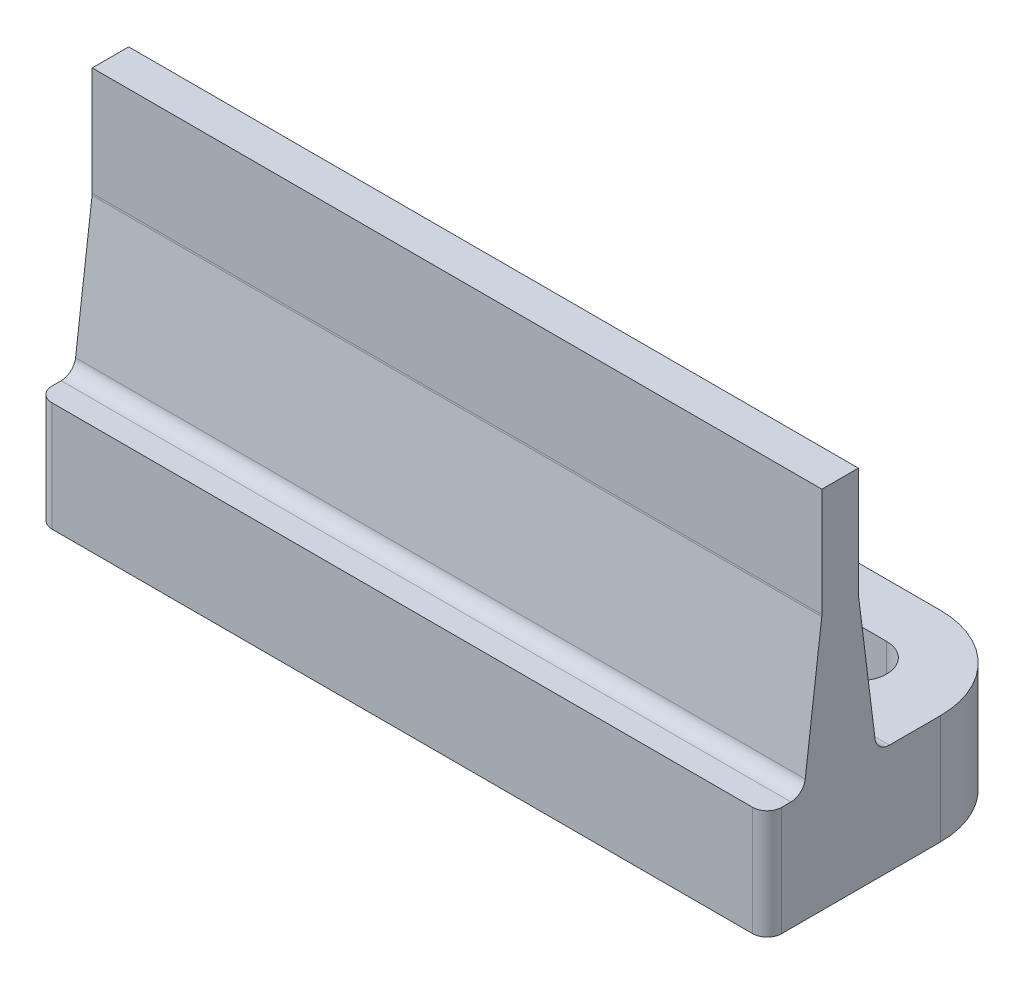
ISO-10303-21;
HEADER;
FILE_DESCRIPTION(('STEP AP214'),'2;1');
FILE_NAME('part.step','',(''),(''),'','','');
FILE_SCHEMA(('AUTOMOTIVE_DESIGN { 1 0 10303 214 1 1 1 1 }'));
ENDSEC;
DATA;
#1=APPLICATION_CONTEXT('core data for automotive mechanical design processes');
#2=APPLICATION_PROTOCOL_DEFINITION('international standard','automotive_design',2000,#1);
#3=PRODUCT_CONTEXT('',#1,'mechanical');
#4=PRODUCT('Part','Part','',(#3));
#5=PRODUCT_RELATED_PRODUCT_CATEGORY('part','',(#4));
#6=PRODUCT_DEFINITION_FORMATION('','',#4);
#7=PRODUCT_DEFINITION_CONTEXT('part definition',#1,'design');
#8=PRODUCT_DEFINITION('design','',#6,#7);
#9=PRODUCT_DEFINITION_SHAPE('','',#8);
#10=(LENGTH_UNIT() NAMED_UNIT(*) SI_UNIT(.MILLI.,.METRE.));
#11=(NAMED_UNIT(*) PLANE_ANGLE_UNIT() SI_UNIT($,.RADIAN.));
#12=(NAMED_UNIT(*) SI_UNIT($,.STERADIAN.) SOLID_ANGLE_UNIT());
#13=UNCERTAINTY_MEASURE_WITH_UNIT(LENGTH_MEASURE(1.E-05),#10,'distance_accuracy_value','');
#14=(GEOMETRIC_REPRESENTATION_CONTEXT(3) GLOBAL_UNCERTAINTY_ASSIGNED_CONTEXT((#13)) GLOBAL_UNIT_ASSIGNED_CONTEXT((#10,
#11,#12)) REPRESENTATION_CONTEXT('',''));
#15=CARTESIAN_POINT('',(0.,0.,0.));
#16=DIRECTION('',(0.,0.,1.));
#17=DIRECTION('',(1.,0.,0.));
#18=AXIS2_PLACEMENT_3D('',#15,#16,#17);
#19=CARTESIAN_POINT('',(20.,6.,4.));
#20=DIRECTION('',(0.,0.,-1.));
#21=DIRECTION('',(0.,1.,0.));
#22=AXIS2_PLACEMENT_3D('',#19,#20,#21);
#23=PLANE('',#22);
#24=DIRECTION('',(-1.,0.,0.));
#25=VECTOR('',#24,1.);
#26=CARTESIAN_POINT('',(20.,0.,4.));
#27=LINE('',#26,#25);
#28=CARTESIAN_POINT('',(19.20625,0.,4.));
#29=VERTEX_POINT('',#28);
#30=CARTESIAN_POINT('',(-19.20625,0.,4.));
#31=VERTEX_POINT('',#30);
#32=EDGE_CURVE('E387',#29,#31,#27,.T.);
#33=ORIENTED_EDGE('',*,*,#32,.F.);
#34=DIRECTION('',(0.,-1.,0.));
#35=VECTOR('',#34,1.);
#36=CARTESIAN_POINT('',(19.20625,6.,4.));
#37=LINE('',#36,#35);
#38=CARTESIAN_POINT('',(19.20625,6.,4.));
#39=VERTEX_POINT('',#38);
#40=EDGE_CURVE('E464',#29,#39,#37,.F.);
#41=ORIENTED_EDGE('',*,*,#40,.T.);
#42=DIRECTION('',(-1.,0.,0.));
#43=VECTOR('',#42,1.);
#44=CARTESIAN_POINT('',(20.,6.,4.));
#45=LINE('',#44,#43);
#46=CARTESIAN_POINT('',(-19.20625,6.,4.));
#47=VERTEX_POINT('',#46);
#48=EDGE_CURVE('E340',#39,#47,#45,.T.);
#49=ORIENTED_EDGE('',*,*,#48,.T.);
#50=DIRECTION('',(0.,-1.,0.));
#51=VECTOR('',#50,1.);
#52=CARTESIAN_POINT('',(-19.20625,6.,4.));
#53=LINE('',#52,#51);
#54=EDGE_CURVE('E461',#47,#31,#53,.T.);
#55=ORIENTED_EDGE('',*,*,#54,.T.);
#56=EDGE_LOOP('',(#33,#41,#49,#55));
#57=FACE_BOUND('',#56,.T.);
#58=ADVANCED_FACE('F39',(#57),#23,.F.);
#59=CARTESIAN_POINT('',(20.,0.,4.));
#60=DIRECTION('',(0.,1.,0.));
#61=DIRECTION('',(0.,0.,1.));
#62=AXIS2_PLACEMENT_3D('',#59,#60,#61);
#63=PLANE('',#62);
#64=DIRECTION('',(1.,0.,0.));
#65=VECTOR('',#64,1.);
#66=CARTESIAN_POINT('',(-15.,0.,-7.55));
#67=LINE('',#66,#65);
#68=CARTESIAN_POINT('',(-15.,0.,-7.55));
#69=VERTEX_POINT('',#68);
#70=CARTESIAN_POINT('',(-5.,0.,-7.55));
#71=VERTEX_POINT('',#70);
#72=EDGE_CURVE('E240',#69,#71,#67,.T.);
#73=ORIENTED_EDGE('',*,*,#72,.F.);
#74=CARTESIAN_POINT('',(-15.,0.,-6.));
#75=DIRECTION('',(0.,1.,0.));
#76=DIRECTION('',(0.,0.,1.));
#77=AXIS2_PLACEMENT_3D('',#74,#75,#76);
#78=CIRCLE('',#77,1.55);
#79=CARTESIAN_POINT('',(-15.,0.,-4.45));
#80=VERTEX_POINT('',#79);
#81=EDGE_CURVE('E216',#80,#69,#78,.F.);
#82=ORIENTED_EDGE('',*,*,#81,.F.);
#83=DIRECTION('',(-1.,0.,0.));
#84=VECTOR('',#83,1.);
#85=CARTESIAN_POINT('',(-15.,0.,-4.45));
#86=LINE('',#85,#84);
#87=CARTESIAN_POINT('',(-5.,0.,-4.45));
#88=VERTEX_POINT('',#87);
#89=EDGE_CURVE('E229',#88,#80,#86,.T.);
#90=ORIENTED_EDGE('',*,*,#89,.F.);
#91=CARTESIAN_POINT('',(-5.,0.,-6.));
#92=DIRECTION('',(0.,1.,0.));
#93=DIRECTION('',(0.,0.,1.));
#94=AXIS2_PLACEMENT_3D('',#91,#92,#93);
#95=CIRCLE('',#94,1.55);
#96=EDGE_CURVE('E247',#71,#88,#95,.F.);
#97=ORIENTED_EDGE('',*,*,#96,.F.);
#98=EDGE_LOOP('',(#73,#82,#90,#97));
#99=FACE_BOUND('',#98,.T.);
#100=DIRECTION('',(1.,0.,0.));
#101=VECTOR('',#100,1.);
#102=CARTESIAN_POINT('',(5.,0.,-7.55));
#103=LINE('',#102,#101);
#104=CARTESIAN_POINT('',(5.,0.,-7.55));
#105=VERTEX_POINT('',#104);
#106=CARTESIAN_POINT('',(15.,0.,-7.55));
#107=VERTEX_POINT('',#106);
#108=EDGE_CURVE('E270',#105,#107,#103,.T.);
#109=ORIENTED_EDGE('',*,*,#108,.F.);
#110=CARTESIAN_POINT('',(5.,0.,-6.));
#111=DIRECTION('',(0.,1.,0.));
#112=DIRECTION('',(0.,0.,1.));
#113=AXIS2_PLACEMENT_3D('',#110,#111,#112);
#114=CIRCLE('',#113,1.55);
#115=CARTESIAN_POINT('',(5.,0.,-4.45));
#116=VERTEX_POINT('',#115);
#117=EDGE_CURVE('E274',#116,#105,#114,.F.);
#118=ORIENTED_EDGE('',*,*,#117,.F.);
#119=DIRECTION('',(-1.,0.,0.));
#120=VECTOR('',#119,1.);
#121=CARTESIAN_POINT('',(5.,0.,-4.45));
#122=LINE('',#121,#120);
#123=CARTESIAN_POINT('',(15.,0.,-4.45));
#124=VERTEX_POINT('',#123);
#125=EDGE_CURVE('E297',#124,#116,#122,.T.);
#126=ORIENTED_EDGE('',*,*,#125,.F.);
#127=CARTESIAN_POINT('',(15.,0.,-6.));
#128=DIRECTION('',(0.,1.,0.));
#129=DIRECTION('',(0.,0.,1.));
#130=AXIS2_PLACEMENT_3D('',#127,#128,#129);
#131=CIRCLE('',#130,1.55);
#132=EDGE_CURVE('E267',#107,#124,#131,.F.);
#133=ORIENTED_EDGE('',*,*,#132,.F.);
#134=EDGE_LOOP('',(#109,#118,#126,#133));
#135=FACE_BOUND('',#134,.T.);
#136=DIRECTION('',(0.,0.,-1.));
#137=VECTOR('',#136,1.);
#138=CARTESIAN_POINT('',(20.,0.,4.));
#139=LINE('',#138,#137);
#140=CARTESIAN_POINT('',(20.,0.,3.20625));
#141=VERTEX_POINT('',#140);
#142=CARTESIAN_POINT('',(20.,0.,-5.5));
#143=VERTEX_POINT('',#142);
#144=EDGE_CURVE('E310',#141,#143,#139,.T.);
#145=ORIENTED_EDGE('',*,*,#144,.F.);
#146=CARTESIAN_POINT('',(19.20625,0.,3.20625));
#147=DIRECTION('',(0.,1.,0.));
#148=DIRECTION('',(0.,0.,1.));
#149=AXIS2_PLACEMENT_3D('',#146,#147,#148);
#150=CIRCLE('',#149,0.79375);
#151=EDGE_CURVE('E458',#141,#29,#150,.F.);
#152=ORIENTED_EDGE('',*,*,#151,.T.);
#153=ORIENTED_EDGE('',*,*,#32,.T.);
#154=CARTESIAN_POINT('',(-19.20625,0.,3.20625));
#155=DIRECTION('',(0.,1.,0.));
#156=DIRECTION('',(0.,0.,1.));
#157=AXIS2_PLACEMENT_3D('',#154,#155,#156);
#158=CIRCLE('',#157,0.79375);
#159=CARTESIAN_POINT('',(-20.,0.,3.20625));
#160=VERTEX_POINT('',#159);
#161=EDGE_CURVE('E55',#31,#160,#158,.F.);
#162=ORIENTED_EDGE('',*,*,#161,.T.);
#163=DIRECTION('',(0.,0.,-1.));
#164=VECTOR('',#163,1.);
#165=CARTESIAN_POINT('',(-20.,0.,4.));
#166=LINE('',#165,#164);
#167=CARTESIAN_POINT('',(-20.,0.,-5.5));
#168=VERTEX_POINT('',#167);
#169=EDGE_CURVE('E234',#160,#168,#166,.T.);
#170=ORIENTED_EDGE('',*,*,#169,.T.);
#171=CARTESIAN_POINT('',(-15.,0.,-5.5));
#172=DIRECTION('',(0.,1.,0.));
#173=DIRECTION('',(0.,0.,1.));
#174=AXIS2_PLACEMENT_3D('',#171,#172,#173);
#175=CIRCLE('',#174,5.);
#176=CARTESIAN_POINT('',(-15.,0.,-10.5));
#177=VERTEX_POINT('',#176);
#178=EDGE_CURVE('E407',#168,#177,#175,.F.);
#179=ORIENTED_EDGE('',*,*,#178,.T.);
#180=DIRECTION('',(-1.,0.,0.));
#181=VECTOR('',#180,1.);
#182=CARTESIAN_POINT('',(20.,0.,-10.5));
#183=LINE('',#182,#181);
#184=CARTESIAN_POINT('',(15.,0.,-10.5));
#185=VERTEX_POINT('',#184);
#186=EDGE_CURVE('E383',#185,#177,#183,.T.);
#187=ORIENTED_EDGE('',*,*,#186,.F.);
#188=CARTESIAN_POINT('',(15.,0.,-5.5));
#189=DIRECTION('',(0.,1.,0.));
#190=DIRECTION('',(0.,0.,1.));
#191=AXIS2_PLACEMENT_3D('',#188,#189,#190);
#192=CIRCLE('',#191,5.);
#193=EDGE_CURVE('E410',#185,#143,#192,.F.);
#194=ORIENTED_EDGE('',*,*,#193,.T.);
#195=EDGE_LOOP('',(#145,#152,#153,#162,#170,#179,#187,#194));
#196=FACE_BOUND('',#195,.T.);
#197=ADVANCED_FACE('F237',(#99,#135,#196),#63,.F.);
#198=CARTESIAN_POINT('',(20.,0.,-10.5));
#199=DIRECTION('',(0.,0.,1.));
#200=DIRECTION('',(1.,0.,0.));
#201=AXIS2_PLACEMENT_3D('',#198,#199,#200);
#202=PLANE('',#201);
#203=DIRECTION('',(-1.,0.,0.));
#204=VECTOR('',#203,1.);
#205=CARTESIAN_POINT('',(20.,6.,-10.5));
#206=LINE('',#205,#204);
#207=CARTESIAN_POINT('',(15.,6.,-10.5));
#208=VERTEX_POINT('',#207);
#209=CARTESIAN_POINT('',(-15.,6.,-10.5));
#210=VERTEX_POINT('',#209);
#211=EDGE_CURVE('E379',#208,#210,#206,.T.);
#212=ORIENTED_EDGE('',*,*,#211,.F.);
#213=DIRECTION('',(0.,1.,0.));
#214=VECTOR('',#213,1.);
#215=CARTESIAN_POINT('',(15.,0.,-10.5));
#216=LINE('',#215,#214);
#217=EDGE_CURVE('E404',#208,#185,#216,.F.);
#218=ORIENTED_EDGE('',*,*,#217,.T.);
#219=ORIENTED_EDGE('',*,*,#186,.T.);
#220=DIRECTION('',(0.,1.,0.));
#221=VECTOR('',#220,1.);
#222=CARTESIAN_POINT('',(-15.,0.,-10.5));
#223=LINE('',#222,#221);
#224=EDGE_CURVE('E400',#177,#210,#223,.T.);
#225=ORIENTED_EDGE('',*,*,#224,.T.);
#226=EDGE_LOOP('',(#212,#218,#219,#225));
#227=FACE_BOUND('',#226,.T.);
#228=ADVANCED_FACE('F571',(#227),#202,.F.);
#229=CARTESIAN_POINT('',(20.,6.,-10.5));
#230=DIRECTION('',(0.,-1.,0.));
#231=DIRECTION('',(0.,0.,-1.));
#232=AXIS2_PLACEMENT_3D('',#229,#230,#231);
#233=PLANE('',#232);
#234=DIRECTION('',(1.,0.,0.));
#235=VECTOR('',#234,1.);
#236=CARTESIAN_POINT('',(-15.,6.,-4.45));
#237=LINE('',#236,#235);
#238=CARTESIAN_POINT('',(-15.,6.,-4.45));
#239=VERTEX_POINT('',#238);
#240=CARTESIAN_POINT('',(-5.,6.,-4.45));
#241=VERTEX_POINT('',#240);
#242=EDGE_CURVE('E245',#239,#241,#237,.T.);
#243=ORIENTED_EDGE('',*,*,#242,.F.);
#244=CARTESIAN_POINT('',(-15.,6.,-6.));
#245=DIRECTION('',(0.,1.,0.));
#246=DIRECTION('',(0.,0.,1.));
#247=AXIS2_PLACEMENT_3D('',#244,#245,#246);
#248=CIRCLE('',#247,1.55);
#249=CARTESIAN_POINT('',(-15.,6.,-7.55));
#250=VERTEX_POINT('',#249);
#251=EDGE_CURVE('E219',#250,#239,#248,.T.);
#252=ORIENTED_EDGE('',*,*,#251,.F.);
#253=DIRECTION('',(-1.,0.,0.));
#254=VECTOR('',#253,1.);
#255=CARTESIAN_POINT('',(-15.,6.,-7.55));
#256=LINE('',#255,#254);
#257=CARTESIAN_POINT('',(-5.,6.,-7.55));
#258=VERTEX_POINT('',#257);
#259=EDGE_CURVE('E225',#258,#250,#256,.T.);
#260=ORIENTED_EDGE('',*,*,#259,.F.);
#261=CARTESIAN_POINT('',(-5.,6.,-6.));
#262=DIRECTION('',(0.,1.,0.));
#263=DIRECTION('',(0.,0.,1.));
#264=AXIS2_PLACEMENT_3D('',#261,#262,#263);
#265=CIRCLE('',#264,1.55);
#266=EDGE_CURVE('E253',#241,#258,#265,.T.);
#267=ORIENTED_EDGE('',*,*,#266,.F.);
#268=EDGE_LOOP('',(#243,#252,#260,#267));
#269=FACE_BOUND('',#268,.T.);
#270=DIRECTION('',(1.,0.,0.));
#271=VECTOR('',#270,1.);
#272=CARTESIAN_POINT('',(5.,6.,-4.45));
#273=LINE('',#272,#271);
#274=CARTESIAN_POINT('',(5.,6.,-4.45));
#275=VERTEX_POINT('',#274);
#276=CARTESIAN_POINT('',(15.,6.,-4.45));
#277=VERTEX_POINT('',#276);
#278=EDGE_CURVE('E281',#275,#277,#273,.T.);
#279=ORIENTED_EDGE('',*,*,#278,.F.);
#280=CARTESIAN_POINT('',(5.,6.,-6.));
#281=DIRECTION('',(0.,1.,0.));
#282=DIRECTION('',(0.,0.,1.));
#283=AXIS2_PLACEMENT_3D('',#280,#281,#282);
#284=CIRCLE('',#283,1.55);
#285=CARTESIAN_POINT('',(5.,6.,-7.55));
#286=VERTEX_POINT('',#285);
#287=EDGE_CURVE('E278',#286,#275,#284,.T.);
#288=ORIENTED_EDGE('',*,*,#287,.F.);
#289=DIRECTION('',(-1.,0.,0.));
#290=VECTOR('',#289,1.);
#291=CARTESIAN_POINT('',(5.,6.,-7.55));
#292=LINE('',#291,#290);
#293=CARTESIAN_POINT('',(15.,6.,-7.55));
#294=VERTEX_POINT('',#293);
#295=EDGE_CURVE('E289',#294,#286,#292,.T.);
#296=ORIENTED_EDGE('',*,*,#295,.F.);
#297=CARTESIAN_POINT('',(15.,6.,-6.));
#298=DIRECTION('',(0.,1.,0.));
#299=DIRECTION('',(0.,0.,1.));
#300=AXIS2_PLACEMENT_3D('',#297,#298,#299);
#301=CIRCLE('',#300,1.55);
#302=EDGE_CURVE('E285',#277,#294,#301,.T.);
#303=ORIENTED_EDGE('',*,*,#302,.F.);
#304=EDGE_LOOP('',(#279,#288,#296,#303));
#305=FACE_BOUND('',#304,.T.);
#306=DIRECTION('',(0.,0.,1.));
#307=VECTOR('',#306,1.);
#308=CARTESIAN_POINT('',(-20.,6.,-10.5));
#309=LINE('',#308,#307);
#310=CARTESIAN_POINT('',(-20.,6.,-5.5));
#311=VERTEX_POINT('',#310);
#312=CARTESIAN_POINT('',(-20.,6.,-2.700708385964));
#313=VERTEX_POINT('',#312);
#314=EDGE_CURVE('E343',#311,#313,#309,.T.);
#315=ORIENTED_EDGE('',*,*,#314,.T.);
#316=DIRECTION('',(-1.,0.,0.));
#317=VECTOR('',#316,1.);
#318=CARTESIAN_POINT('',(20.,6.,-2.700708385964));
#319=LINE('',#318,#317);
#320=CARTESIAN_POINT('',(20.,6.,-2.700708385964));
#321=VERTEX_POINT('',#320);
#322=EDGE_CURVE('E425',#313,#321,#319,.F.);
#323=ORIENTED_EDGE('',*,*,#322,.T.);
#324=DIRECTION('',(0.,0.,1.));
#325=VECTOR('',#324,1.);
#326=CARTESIAN_POINT('',(20.,6.,-10.5));
#327=LINE('',#326,#325);
#328=CARTESIAN_POINT('',(20.,6.,-5.5));
#329=VERTEX_POINT('',#328);
#330=EDGE_CURVE('E313',#329,#321,#327,.T.);
#331=ORIENTED_EDGE('',*,*,#330,.F.);
#332=CARTESIAN_POINT('',(15.,6.,-5.5));
#333=DIRECTION('',(0.,-1.,0.));
#334=DIRECTION('',(0.,0.,-1.));
#335=AXIS2_PLACEMENT_3D('',#332,#333,#334);
#336=CIRCLE('',#335,5.);
#337=EDGE_CURVE('E397',#329,#208,#336,.F.);
#338=ORIENTED_EDGE('',*,*,#337,.T.);
#339=ORIENTED_EDGE('',*,*,#211,.T.);
#340=CARTESIAN_POINT('',(-15.,6.,-5.5));
#341=DIRECTION('',(0.,-1.,0.));
#342=DIRECTION('',(0.,0.,-1.));
#343=AXIS2_PLACEMENT_3D('',#340,#341,#342);
#344=CIRCLE('',#343,5.);
#345=EDGE_CURVE('E394',#210,#311,#344,.F.);
#346=ORIENTED_EDGE('',*,*,#345,.T.);
#347=EDGE_LOOP('',(#315,#323,#331,#338,#339,#346));
#348=FACE_BOUND('',#347,.T.);
#349=ADVANCED_FACE('F523',(#269,#305,#348),#233,.F.);
#350=CARTESIAN_POINT('',(20.,6.,-2.));
#351=DIRECTION('',(0.,-0.124034734589208,0.992277876713668));
#352=DIRECTION('',(0.,-0.992277876713668,-0.124034734589208));
#353=AXIS2_PLACEMENT_3D('',#350,#351,#352);
#354=PLANE('',#353);
#355=DIRECTION('',(0.,0.992277876713668,0.124034734589208));
#356=VECTOR('',#355,1.);
#357=CARTESIAN_POINT('',(20.,6.,-2.));
#358=LINE('',#357,#356);
#359=CARTESIAN_POINT('',(20.,6.69529742941981,-1.91308782132252));
#360=VERTEX_POINT('',#359);
#361=CARTESIAN_POINT('',(20.,13.9509645171318,-1.00612943535853));
#362=VERTEX_POINT('',#361);
#363=EDGE_CURVE('E318',#360,#362,#358,.T.);
#364=ORIENTED_EDGE('',*,*,#363,.F.);
#365=DIRECTION('',(-1.,0.,0.));
#366=VECTOR('',#365,1.);
#367=CARTESIAN_POINT('',(-20.,6.69529742941981,-1.91308782132252));
#368=LINE('',#367,#366);
#369=CARTESIAN_POINT('',(-20.,6.69529742941981,-1.91308782132252));
#370=VERTEX_POINT('',#369);
#371=EDGE_CURVE('E421',#360,#370,#368,.T.);
#372=ORIENTED_EDGE('',*,*,#371,.T.);
#373=DIRECTION('',(0.,0.992277876713668,0.124034734589208));
#374=VECTOR('',#373,1.);
#375=CARTESIAN_POINT('',(-20.,6.,-2.));
#376=LINE('',#375,#374);
#377=CARTESIAN_POINT('',(-20.,13.9509645171318,-1.00612943535853));
#378=VERTEX_POINT('',#377);
#379=EDGE_CURVE('E347',#370,#378,#376,.T.);
#380=ORIENTED_EDGE('',*,*,#379,.T.);
#381=DIRECTION('',(-1.,0.,0.));
#382=VECTOR('',#381,1.);
#383=CARTESIAN_POINT('',(20.,13.9509645171318,-1.00612943535853));
#384=LINE('',#383,#382);
#385=EDGE_CURVE('E418',#378,#362,#384,.F.);
#386=ORIENTED_EDGE('',*,*,#385,.T.);
#387=EDGE_LOOP('',(#364,#372,#380,#386));
#388=FACE_BOUND('',#387,.T.);
#389=ADVANCED_FACE('F533',(#388),#354,.F.);
#390=CARTESIAN_POINT('',(20.,14.,-1.));
#391=DIRECTION('',(0.,0.,1.));
#392=DIRECTION('',(1.,0.,0.));
#393=AXIS2_PLACEMENT_3D('',#390,#391,#392);
#394=PLANE('',#393);
#395=DIRECTION('',(0.,1.,0.));
#396=VECTOR('',#395,1.);
#397=CARTESIAN_POINT('',(20.,14.,-1.));
#398=LINE('',#397,#396);
#399=CARTESIAN_POINT('',(20.,14.049417087712,-1.));
#400=VERTEX_POINT('',#399);
#401=CARTESIAN_POINT('',(20.,20.,-1.));
#402=VERTEX_POINT('',#401);
#403=EDGE_CURVE('E322',#400,#402,#398,.T.);
#404=ORIENTED_EDGE('',*,*,#403,.F.);
#405=DIRECTION('',(-1.,0.,0.));
#406=VECTOR('',#405,1.);
#407=CARTESIAN_POINT('',(-20.,14.049417087712,-1.));
#408=LINE('',#407,#406);
#409=CARTESIAN_POINT('',(-20.,14.049417087712,-1.));
#410=VERTEX_POINT('',#409);
#411=EDGE_CURVE('E428',#400,#410,#408,.T.);
#412=ORIENTED_EDGE('',*,*,#411,.T.);
#413=DIRECTION('',(0.,1.,0.));
#414=VECTOR('',#413,1.);
#415=CARTESIAN_POINT('',(-20.,14.,-1.));
#416=LINE('',#415,#414);
#417=CARTESIAN_POINT('',(-20.,20.,-1.));
#418=VERTEX_POINT('',#417);
#419=EDGE_CURVE('E351',#410,#418,#416,.T.);
#420=ORIENTED_EDGE('',*,*,#419,.T.);
#421=DIRECTION('',(-1.,0.,0.));
#422=VECTOR('',#421,1.);
#423=CARTESIAN_POINT('',(20.,20.,-1.));
#424=LINE('',#423,#422);
#425=EDGE_CURVE('E375',#402,#418,#424,.T.);
#426=ORIENTED_EDGE('',*,*,#425,.F.);
#427=EDGE_LOOP('',(#404,#412,#420,#426));
#428=FACE_BOUND('',#427,.T.);
#429=ADVANCED_FACE('F542',(#428),#394,.F.);
#430=CARTESIAN_POINT('',(20.,20.,-1.));
#431=DIRECTION('',(0.,-1.,0.));
#432=DIRECTION('',(0.,0.,-1.));
#433=AXIS2_PLACEMENT_3D('',#430,#431,#432);
#434=PLANE('',#433);
#435=DIRECTION('',(0.,0.,1.));
#436=VECTOR('',#435,1.);
#437=CARTESIAN_POINT('',(-20.,20.,-1.));
#438=LINE('',#437,#436);
#439=CARTESIAN_POINT('',(-20.,20.,1.));
#440=VERTEX_POINT('',#439);
#441=EDGE_CURVE('E354',#418,#440,#438,.T.);
#442=ORIENTED_EDGE('',*,*,#441,.T.);
#443=DIRECTION('',(-1.,0.,0.));
#444=VECTOR('',#443,1.);
#445=CARTESIAN_POINT('',(20.,20.,1.));
#446=LINE('',#445,#444);
#447=CARTESIAN_POINT('',(20.,20.,1.));
#448=VERTEX_POINT('',#447);
#449=EDGE_CURVE('E371',#448,#440,#446,.T.);
#450=ORIENTED_EDGE('',*,*,#449,.F.);
#451=DIRECTION('',(0.,0.,1.));
#452=VECTOR('',#451,1.);
#453=CARTESIAN_POINT('',(20.,20.,-1.));
#454=LINE('',#453,#452);
#455=EDGE_CURVE('E325',#402,#448,#454,.T.);
#456=ORIENTED_EDGE('',*,*,#455,.F.);
#457=ORIENTED_EDGE('',*,*,#425,.T.);
#458=EDGE_LOOP('',(#442,#450,#456,#457));
#459=FACE_BOUND('',#458,.T.);
#460=ADVANCED_FACE('F548',(#459),#434,.F.);
#461=CARTESIAN_POINT('',(20.,20.,1.));
#462=DIRECTION('',(0.,0.,-1.));
#463=DIRECTION('',(-1.,0.,0.));
#464=AXIS2_PLACEMENT_3D('',#461,#462,#463);
#465=PLANE('',#464);
#466=DIRECTION('',(0.,-1.,0.));
#467=VECTOR('',#466,1.);
#468=CARTESIAN_POINT('',(-20.,20.,1.));
#469=LINE('',#468,#467);
#470=CARTESIAN_POINT('',(-20.,14.049417087712,1.));
#471=VERTEX_POINT('',#470);
#472=EDGE_CURVE('E357',#440,#471,#469,.T.);
#473=ORIENTED_EDGE('',*,*,#472,.T.);
#474=DIRECTION('',(-1.,0.,0.));
#475=VECTOR('',#474,1.);
#476=CARTESIAN_POINT('',(20.,14.049417087712,1.));
#477=LINE('',#476,#475);
#478=CARTESIAN_POINT('',(20.,14.049417087712,1.));
#479=VERTEX_POINT('',#478);
#480=EDGE_CURVE('E439',#471,#479,#477,.F.);
#481=ORIENTED_EDGE('',*,*,#480,.T.);
#482=DIRECTION('',(0.,-1.,0.));
#483=VECTOR('',#482,1.);
#484=CARTESIAN_POINT('',(20.,20.,1.));
#485=LINE('',#484,#483);
#486=EDGE_CURVE('E328',#448,#479,#485,.T.);
#487=ORIENTED_EDGE('',*,*,#486,.F.);
#488=ORIENTED_EDGE('',*,*,#449,.T.);
#489=EDGE_LOOP('',(#473,#481,#487,#488));
#490=FACE_BOUND('',#489,.T.);
#491=ADVANCED_FACE('F556',(#490),#465,.F.);
#492=CARTESIAN_POINT('',(20.,14.,1.));
#493=DIRECTION('',(0.,-0.124034734589208,-0.992277876713668));
#494=DIRECTION('',(0.,0.992277876713668,-0.124034734589208));
#495=AXIS2_PLACEMENT_3D('',#492,#493,#494);
#496=PLANE('',#495);
#497=DIRECTION('',(0.,-0.992277876713668,0.124034734589208));
#498=VECTOR('',#497,1.);
#499=CARTESIAN_POINT('',(20.,14.,1.));
#500=LINE('',#499,#498);
#501=CARTESIAN_POINT('',(20.,13.9509645171318,1.00612943535853));
#502=VERTEX_POINT('',#501);
#503=CARTESIAN_POINT('',(20.,6.69529742941981,1.91308782132252));
#504=VERTEX_POINT('',#503);
#505=EDGE_CURVE('E332',#502,#504,#500,.T.);
#506=ORIENTED_EDGE('',*,*,#505,.F.);
#507=DIRECTION('',(-1.,0.,0.));
#508=VECTOR('',#507,1.);
#509=CARTESIAN_POINT('',(-20.,13.9509645171318,1.00612943535853));
#510=LINE('',#509,#508);
#511=CARTESIAN_POINT('',(-20.,13.9509645171318,1.00612943535853));
#512=VERTEX_POINT('',#511);
#513=EDGE_CURVE('E435',#502,#512,#510,.T.);
#514=ORIENTED_EDGE('',*,*,#513,.T.);
#515=DIRECTION('',(0.,-0.992277876713668,0.124034734589208));
#516=VECTOR('',#515,1.);
#517=CARTESIAN_POINT('',(-20.,14.,1.));
#518=LINE('',#517,#516);
#519=CARTESIAN_POINT('',(-20.,6.69529742941981,1.91308782132252));
#520=VERTEX_POINT('',#519);
#521=EDGE_CURVE('E361',#512,#520,#518,.T.);
#522=ORIENTED_EDGE('',*,*,#521,.T.);
#523=DIRECTION('',(-1.,0.,0.));
#524=VECTOR('',#523,1.);
#525=CARTESIAN_POINT('',(20.,6.69529742941981,1.91308782132252));
#526=LINE('',#525,#524);
#527=EDGE_CURVE('E432',#520,#504,#526,.F.);
#528=ORIENTED_EDGE('',*,*,#527,.T.);
#529=EDGE_LOOP('',(#506,#514,#522,#528));
#530=FACE_BOUND('',#529,.T.);
#531=ADVANCED_FACE('F497',(#530),#496,.F.);
#532=CARTESIAN_POINT('',(20.,6.,2.));
#533=DIRECTION('',(0.,-1.,0.));
#534=DIRECTION('',(0.,0.,-1.));
#535=AXIS2_PLACEMENT_3D('',#532,#533,#534);
#536=PLANE('',#535);
#537=DIRECTION('',(0.,0.,1.));
#538=VECTOR('',#537,1.);
#539=CARTESIAN_POINT('',(20.,6.,2.));
#540=LINE('',#539,#538);
#541=CARTESIAN_POINT('',(20.,6.,2.700708385964));
#542=VERTEX_POINT('',#541);
#543=CARTESIAN_POINT('',(20.,6.,3.20625));
#544=VERTEX_POINT('',#543);
#545=EDGE_CURVE('E336',#542,#544,#540,.T.);
#546=ORIENTED_EDGE('',*,*,#545,.F.);
#547=DIRECTION('',(-1.,0.,0.));
#548=VECTOR('',#547,1.);
#549=CARTESIAN_POINT('',(-20.,6.,2.700708385964));
#550=LINE('',#549,#548);
#551=CARTESIAN_POINT('',(-20.,6.,2.700708385964));
#552=VERTEX_POINT('',#551);
#553=EDGE_CURVE('E448',#542,#552,#550,.T.);
#554=ORIENTED_EDGE('',*,*,#553,.T.);
#555=DIRECTION('',(0.,0.,1.));
#556=VECTOR('',#555,1.);
#557=CARTESIAN_POINT('',(-20.,6.,2.));
#558=LINE('',#557,#556);
#559=CARTESIAN_POINT('',(-20.,6.,3.20625));
#560=VERTEX_POINT('',#559);
#561=EDGE_CURVE('E314',#552,#560,#558,.T.);
#562=ORIENTED_EDGE('',*,*,#561,.T.);
#563=CARTESIAN_POINT('',(-19.20625,6.,3.20625));
#564=DIRECTION('',(0.,-1.,0.));
#565=DIRECTION('',(0.,0.,-1.));
#566=AXIS2_PLACEMENT_3D('',#563,#564,#565);
#567=CIRCLE('',#566,0.79375);
#568=EDGE_CURVE('E442',#560,#47,#567,.F.);
#569=ORIENTED_EDGE('',*,*,#568,.T.);
#570=ORIENTED_EDGE('',*,*,#48,.F.);
#571=CARTESIAN_POINT('',(19.20625,6.,3.20625));
#572=DIRECTION('',(0.,-1.,0.));
#573=DIRECTION('',(0.,0.,-1.));
#574=AXIS2_PLACEMENT_3D('',#571,#572,#573);
#575=CIRCLE('',#574,0.79375);
#576=EDGE_CURVE('E445',#39,#544,#575,.F.);
#577=ORIENTED_EDGE('',*,*,#576,.T.);
#578=EDGE_LOOP('',(#546,#554,#562,#569,#570,#577));
#579=FACE_BOUND('',#578,.T.);
#580=ADVANCED_FACE('F506',(#579),#536,.F.);
#581=CARTESIAN_POINT('',(20.,0.,0.));
#582=DIRECTION('',(1.,0.,0.));
#583=DIRECTION('',(0.,0.,-1.));
#584=AXIS2_PLACEMENT_3D('',#581,#582,#583);
#585=PLANE('',#584);
#586=ORIENTED_EDGE('',*,*,#545,.T.);
#587=DIRECTION('',(0.,-1.,0.));
#588=VECTOR('',#587,1.);
#589=CARTESIAN_POINT('',(20.,0.,3.20625));
#590=LINE('',#589,#588);
#591=EDGE_CURVE('E452',#544,#141,#590,.T.);
#592=ORIENTED_EDGE('',*,*,#591,.T.);
#593=ORIENTED_EDGE('',*,*,#144,.T.);
#594=DIRECTION('',(0.,1.,0.));
#595=VECTOR('',#594,1.);
#596=CARTESIAN_POINT('',(20.,6.,-5.5));
#597=LINE('',#596,#595);
#598=EDGE_CURVE('E390',#143,#329,#597,.T.);
#599=ORIENTED_EDGE('',*,*,#598,.T.);
#600=ORIENTED_EDGE('',*,*,#330,.T.);
#601=CARTESIAN_POINT('',(20.,6.79375,-2.700708385964));
#602=DIRECTION('',(1.,0.,0.));
#603=DIRECTION('',(0.,0.,-1.));
#604=AXIS2_PLACEMENT_3D('',#601,#602,#603);
#605=CIRCLE('',#604,0.79375);
#606=EDGE_CURVE('E473',#321,#360,#605,.F.);
#607=ORIENTED_EDGE('',*,*,#606,.T.);
#608=ORIENTED_EDGE('',*,*,#363,.T.);
#609=CARTESIAN_POINT('',(20.,14.049417087712,-1.79375));
#610=DIRECTION('',(1.,0.,0.));
#611=DIRECTION('',(0.,0.,-1.));
#612=AXIS2_PLACEMENT_3D('',#609,#610,#611);
#613=CIRCLE('',#612,0.79375);
#614=EDGE_CURVE('E479',#362,#400,#613,.F.);
#615=ORIENTED_EDGE('',*,*,#614,.T.);
#616=ORIENTED_EDGE('',*,*,#403,.T.);
#617=ORIENTED_EDGE('',*,*,#455,.T.);
#618=ORIENTED_EDGE('',*,*,#486,.T.);
#619=CARTESIAN_POINT('',(20.,14.049417087712,1.79375));
#620=DIRECTION('',(1.,0.,0.));
#621=DIRECTION('',(0.,0.,-1.));
#622=AXIS2_PLACEMENT_3D('',#619,#620,#621);
#623=CIRCLE('',#622,0.79375);
#624=EDGE_CURVE('E485',#479,#502,#623,.F.);
#625=ORIENTED_EDGE('',*,*,#624,.T.);
#626=ORIENTED_EDGE('',*,*,#505,.T.);
#627=CARTESIAN_POINT('',(20.,6.79375,2.700708385964));
#628=DIRECTION('',(1.,0.,0.));
#629=DIRECTION('',(0.,0.,-1.));
#630=AXIS2_PLACEMENT_3D('',#627,#628,#629);
#631=CIRCLE('',#630,0.79375);
#632=EDGE_CURVE('E11',#504,#542,#631,.F.);
#633=ORIENTED_EDGE('',*,*,#632,.T.);
#634=EDGE_LOOP('',(#586,#592,#593,#599,#600,#607,#608,#615,#616,#617,#618,#625,#626,#633));
#635=FACE_BOUND('',#634,.T.);
#636=ADVANCED_FACE('F503',(#635),#585,.T.);
#637=CARTESIAN_POINT('',(-20.,0.,0.));
#638=DIRECTION('',(1.,0.,0.));
#639=DIRECTION('',(0.,0.,-1.));
#640=AXIS2_PLACEMENT_3D('',#637,#638,#639);
#641=PLANE('',#640);
#642=ORIENTED_EDGE('',*,*,#169,.F.);
#643=DIRECTION('',(0.,-1.,0.));
#644=VECTOR('',#643,1.);
#645=CARTESIAN_POINT('',(-20.,0.,3.20625));
#646=LINE('',#645,#644);
#647=EDGE_CURVE('E467',#160,#560,#646,.F.);
#648=ORIENTED_EDGE('',*,*,#647,.T.);
#649=ORIENTED_EDGE('',*,*,#561,.F.);
#650=CARTESIAN_POINT('',(-20.,6.79375,2.700708385964));
#651=DIRECTION('',(1.,0.,0.));
#652=DIRECTION('',(0.,0.,-1.));
#653=AXIS2_PLACEMENT_3D('',#650,#651,#652);
#654=CIRCLE('',#653,0.79375);
#655=EDGE_CURVE('E48',#552,#520,#654,.T.);
#656=ORIENTED_EDGE('',*,*,#655,.T.);
#657=ORIENTED_EDGE('',*,*,#521,.F.);
#658=CARTESIAN_POINT('',(-20.,14.049417087712,1.79375));
#659=DIRECTION('',(1.,0.,0.));
#660=DIRECTION('',(0.,0.,-1.));
#661=AXIS2_PLACEMENT_3D('',#658,#659,#660);
#662=CIRCLE('',#661,0.79375);
#663=EDGE_CURVE('E482',#512,#471,#662,.T.);
#664=ORIENTED_EDGE('',*,*,#663,.T.);
#665=ORIENTED_EDGE('',*,*,#472,.F.);
#666=ORIENTED_EDGE('',*,*,#441,.F.);
#667=ORIENTED_EDGE('',*,*,#419,.F.);
#668=CARTESIAN_POINT('',(-20.,14.049417087712,-1.79375));
#669=DIRECTION('',(1.,0.,0.));
#670=DIRECTION('',(0.,0.,-1.));
#671=AXIS2_PLACEMENT_3D('',#668,#669,#670);
#672=CIRCLE('',#671,0.79375);
#673=EDGE_CURVE('E476',#410,#378,#672,.T.);
#674=ORIENTED_EDGE('',*,*,#673,.T.);
#675=ORIENTED_EDGE('',*,*,#379,.F.);
#676=CARTESIAN_POINT('',(-20.,6.79375,-2.700708385964));
#677=DIRECTION('',(1.,0.,0.));
#678=DIRECTION('',(0.,0.,-1.));
#679=AXIS2_PLACEMENT_3D('',#676,#677,#678);
#680=CIRCLE('',#679,0.79375);
#681=EDGE_CURVE('E470',#370,#313,#680,.T.);
#682=ORIENTED_EDGE('',*,*,#681,.T.);
#683=ORIENTED_EDGE('',*,*,#314,.F.);
#684=DIRECTION('',(0.,1.,0.));
#685=VECTOR('',#684,1.);
#686=CARTESIAN_POINT('',(-20.,0.,-5.5));
#687=LINE('',#686,#685);
#688=EDGE_CURVE('E414',#311,#168,#687,.F.);
#689=ORIENTED_EDGE('',*,*,#688,.T.);
#690=EDGE_LOOP('',(#642,#648,#649,#656,#657,#664,#665,#666,#667,#674,#675,#682,#683,#689));
#691=FACE_BOUND('',#690,.T.);
#692=ADVANCED_FACE('F491',(#691),#641,.F.);
#693=CARTESIAN_POINT('',(5.,-0.001000000000001,-6.));
#694=DIRECTION('',(0.,1.,0.));
#695=DIRECTION('',(0.,0.,1.));
#696=AXIS2_PLACEMENT_3D('',#693,#694,#695);
#697=CYLINDRICAL_SURFACE('',#696,1.55);
#698=ORIENTED_EDGE('',*,*,#117,.T.);
#699=DIRECTION('',(0.,1.,0.));
#700=VECTOR('',#699,1.);
#701=CARTESIAN_POINT('',(5.,-0.001000000000001,-7.55));
#702=LINE('',#701,#700);
#703=EDGE_CURVE('E294',#105,#286,#702,.T.);
#704=ORIENTED_EDGE('',*,*,#703,.T.);
#705=ORIENTED_EDGE('',*,*,#287,.T.);
#706=DIRECTION('',(0.,1.,0.));
#707=VECTOR('',#706,1.);
#708=CARTESIAN_POINT('',(5.,-0.00100000000000187,-4.45));
#709=LINE('',#708,#707);
#710=EDGE_CURVE('E293',#116,#275,#709,.T.);
#711=ORIENTED_EDGE('',*,*,#710,.F.);
#712=EDGE_LOOP('',(#698,#704,#705,#711));
#713=FACE_BOUND('',#712,.T.);
#714=ADVANCED_FACE('F623',(#713),#697,.F.);
#715=CARTESIAN_POINT('',(5.,-0.001000000000001,-7.55));
#716=DIRECTION('',(0.,0.,-1.));
#717=DIRECTION('',(-1.,0.,0.));
#718=AXIS2_PLACEMENT_3D('',#715,#716,#717);
#719=PLANE('',#718);
#720=ORIENTED_EDGE('',*,*,#108,.T.);
#721=DIRECTION('',(0.,1.,0.));
#722=VECTOR('',#721,1.);
#723=CARTESIAN_POINT('',(15.,-0.001000000000001,-7.55));
#724=LINE('',#723,#722);
#725=EDGE_CURVE('E298',#107,#294,#724,.T.);
#726=ORIENTED_EDGE('',*,*,#725,.T.);
#727=ORIENTED_EDGE('',*,*,#295,.T.);
#728=ORIENTED_EDGE('',*,*,#703,.F.);
#729=EDGE_LOOP('',(#720,#726,#727,#728));
#730=FACE_BOUND('',#729,.T.);
#731=ADVANCED_FACE('F628',(#730),#719,.F.);
#732=CARTESIAN_POINT('',(15.,-0.001000000000001,-6.));
#733=DIRECTION('',(0.,1.,0.));
#734=DIRECTION('',(0.,0.,1.));
#735=AXIS2_PLACEMENT_3D('',#732,#733,#734);
#736=CYLINDRICAL_SURFACE('',#735,1.55);
#737=ORIENTED_EDGE('',*,*,#132,.T.);
#738=DIRECTION('',(0.,1.,0.));
#739=VECTOR('',#738,1.);
#740=CARTESIAN_POINT('',(15.,-0.001000000000001,-4.45));
#741=LINE('',#740,#739);
#742=EDGE_CURVE('E301',#124,#277,#741,.T.);
#743=ORIENTED_EDGE('',*,*,#742,.T.);
#744=ORIENTED_EDGE('',*,*,#302,.T.);
#745=ORIENTED_EDGE('',*,*,#725,.F.);
#746=EDGE_LOOP('',(#737,#743,#744,#745));
#747=FACE_BOUND('',#746,.T.);
#748=ADVANCED_FACE('F640',(#747),#736,.F.);
#749=CARTESIAN_POINT('',(5.,-0.00100000000000187,-4.45));
#750=DIRECTION('',(0.,0.,1.));
#751=DIRECTION('',(1.,0.,0.));
#752=AXIS2_PLACEMENT_3D('',#749,#750,#751);
#753=PLANE('',#752);
#754=ORIENTED_EDGE('',*,*,#125,.T.);
#755=ORIENTED_EDGE('',*,*,#710,.T.);
#756=ORIENTED_EDGE('',*,*,#278,.T.);
#757=ORIENTED_EDGE('',*,*,#742,.F.);
#758=EDGE_LOOP('',(#754,#755,#756,#757));
#759=FACE_BOUND('',#758,.T.);
#760=ADVANCED_FACE('F650',(#759),#753,.F.);
#761=CARTESIAN_POINT('',(-15.,-0.001000000000001,-6.));
#762=DIRECTION('',(0.,1.,0.));
#763=DIRECTION('',(0.,0.,1.));
#764=AXIS2_PLACEMENT_3D('',#761,#762,#763);
#765=CYLINDRICAL_SURFACE('',#764,1.55);
#766=ORIENTED_EDGE('',*,*,#81,.T.);
#767=DIRECTION('',(0.,1.,0.));
#768=VECTOR('',#767,1.);
#769=CARTESIAN_POINT('',(-15.,-0.001000000000001,-7.55));
#770=LINE('',#769,#768);
#771=EDGE_CURVE('E235',#69,#250,#770,.T.);
#772=ORIENTED_EDGE('',*,*,#771,.T.);
#773=ORIENTED_EDGE('',*,*,#251,.T.);
#774=DIRECTION('',(0.,1.,0.));
#775=VECTOR('',#774,1.);
#776=CARTESIAN_POINT('',(-15.,-0.00100000000000187,-4.45));
#777=LINE('',#776,#775);
#778=EDGE_CURVE('E212',#80,#239,#777,.T.);
#779=ORIENTED_EDGE('',*,*,#778,.F.);
#780=EDGE_LOOP('',(#766,#772,#773,#779));
#781=FACE_BOUND('',#780,.T.);
#782=ADVANCED_FACE('F214',(#781),#765,.F.);
#783=CARTESIAN_POINT('',(-15.,-0.001000000000001,-7.55));
#784=DIRECTION('',(0.,0.,-1.));
#785=DIRECTION('',(-1.,0.,0.));
#786=AXIS2_PLACEMENT_3D('',#783,#784,#785);
#787=PLANE('',#786);
#788=ORIENTED_EDGE('',*,*,#72,.T.);
#789=DIRECTION('',(0.,1.,0.));
#790=VECTOR('',#789,1.);
#791=CARTESIAN_POINT('',(-5.,-0.001000000000001,-7.55));
#792=LINE('',#791,#790);
#793=EDGE_CURVE('E262',#71,#258,#792,.T.);
#794=ORIENTED_EDGE('',*,*,#793,.T.);
#795=ORIENTED_EDGE('',*,*,#259,.T.);
#796=ORIENTED_EDGE('',*,*,#771,.F.);
#797=EDGE_LOOP('',(#788,#794,#795,#796));
#798=FACE_BOUND('',#797,.T.);
#799=ADVANCED_FACE('F669',(#798),#787,.F.);
#800=CARTESIAN_POINT('',(-5.,-0.001000000000001,-6.));
#801=DIRECTION('',(0.,1.,0.));
#802=DIRECTION('',(0.,0.,1.));
#803=AXIS2_PLACEMENT_3D('',#800,#801,#802);
#804=CYLINDRICAL_SURFACE('',#803,1.55);
#805=ORIENTED_EDGE('',*,*,#96,.T.);
#806=DIRECTION('',(0.,1.,0.));
#807=VECTOR('',#806,1.);
#808=CARTESIAN_POINT('',(-5.,-0.001000000000001,-4.45));
#809=LINE('',#808,#807);
#810=EDGE_CURVE('E224',#88,#241,#809,.T.);
#811=ORIENTED_EDGE('',*,*,#810,.T.);
#812=ORIENTED_EDGE('',*,*,#266,.T.);
#813=ORIENTED_EDGE('',*,*,#793,.F.);
#814=EDGE_LOOP('',(#805,#811,#812,#813));
#815=FACE_BOUND('',#814,.T.);
#816=ADVANCED_FACE('F678',(#815),#804,.F.);
#817=CARTESIAN_POINT('',(-15.,-0.00100000000000187,-4.45));
#818=DIRECTION('',(0.,0.,1.));
#819=DIRECTION('',(1.,0.,0.));
#820=AXIS2_PLACEMENT_3D('',#817,#818,#819);
#821=PLANE('',#820);
#822=ORIENTED_EDGE('',*,*,#89,.T.);
#823=ORIENTED_EDGE('',*,*,#778,.T.);
#824=ORIENTED_EDGE('',*,*,#242,.T.);
#825=ORIENTED_EDGE('',*,*,#810,.F.);
#826=EDGE_LOOP('',(#822,#823,#824,#825));
#827=FACE_BOUND('',#826,.T.);
#828=ADVANCED_FACE('F230',(#827),#821,.F.);
#829=CARTESIAN_POINT('',(15.,0.,-5.5));
#830=DIRECTION('',(0.,-1.,0.));
#831=DIRECTION('',(0.,0.,-1.));
#832=AXIS2_PLACEMENT_3D('',#829,#830,#831);
#833=CYLINDRICAL_SURFACE('',#832,5.);
#834=ORIENTED_EDGE('',*,*,#193,.F.);
#835=ORIENTED_EDGE('',*,*,#217,.F.);
#836=ORIENTED_EDGE('',*,*,#337,.F.);
#837=ORIENTED_EDGE('',*,*,#598,.F.);
#838=EDGE_LOOP('',(#834,#835,#836,#837));
#839=FACE_BOUND('',#838,.T.);
#840=ADVANCED_FACE('F519',(#839),#833,.T.);
#841=CARTESIAN_POINT('',(-15.,0.,-5.5));
#842=DIRECTION('',(0.,1.,0.));
#843=DIRECTION('',(0.,0.,1.));
#844=AXIS2_PLACEMENT_3D('',#841,#842,#843);
#845=CYLINDRICAL_SURFACE('',#844,5.);
#846=ORIENTED_EDGE('',*,*,#178,.F.);
#847=ORIENTED_EDGE('',*,*,#688,.F.);
#848=ORIENTED_EDGE('',*,*,#345,.F.);
#849=ORIENTED_EDGE('',*,*,#224,.F.);
#850=EDGE_LOOP('',(#846,#847,#848,#849));
#851=FACE_BOUND('',#850,.T.);
#852=ADVANCED_FACE('F577',(#851),#845,.T.);
#853=CARTESIAN_POINT('',(20.,6.79375,-2.700708385964));
#854=DIRECTION('',(1.,0.,0.));
#855=DIRECTION('',(0.,0.,-1.));
#856=AXIS2_PLACEMENT_3D('',#853,#854,#855);
#857=CYLINDRICAL_SURFACE('',#856,0.79375);
#858=ORIENTED_EDGE('',*,*,#606,.F.);
#859=ORIENTED_EDGE('',*,*,#322,.F.);
#860=ORIENTED_EDGE('',*,*,#681,.F.);
#861=ORIENTED_EDGE('',*,*,#371,.F.);
#862=EDGE_LOOP('',(#858,#859,#860,#861));
#863=FACE_BOUND('',#862,.T.);
#864=ADVANCED_FACE('F528',(#863),#857,.F.);
#865=CARTESIAN_POINT('',(20.,14.049417087712,-1.79375));
#866=DIRECTION('',(1.,0.,0.));
#867=DIRECTION('',(0.,0.,-1.));
#868=AXIS2_PLACEMENT_3D('',#865,#866,#867);
#869=CYLINDRICAL_SURFACE('',#868,0.79375);
#870=ORIENTED_EDGE('',*,*,#614,.F.);
#871=ORIENTED_EDGE('',*,*,#385,.F.);
#872=ORIENTED_EDGE('',*,*,#673,.F.);
#873=ORIENTED_EDGE('',*,*,#411,.F.);
#874=EDGE_LOOP('',(#870,#871,#872,#873));
#875=FACE_BOUND('',#874,.T.);
#876=ADVANCED_FACE('F537',(#875),#869,.F.);
#877=CARTESIAN_POINT('',(20.,14.049417087712,1.79375));
#878=DIRECTION('',(1.,0.,0.));
#879=DIRECTION('',(0.,0.,-1.));
#880=AXIS2_PLACEMENT_3D('',#877,#878,#879);
#881=CYLINDRICAL_SURFACE('',#880,0.79375);
#882=ORIENTED_EDGE('',*,*,#624,.F.);
#883=ORIENTED_EDGE('',*,*,#480,.F.);
#884=ORIENTED_EDGE('',*,*,#663,.F.);
#885=ORIENTED_EDGE('',*,*,#513,.F.);
#886=EDGE_LOOP('',(#882,#883,#884,#885));
#887=FACE_BOUND('',#886,.T.);
#888=ADVANCED_FACE('F554',(#887),#881,.F.);
#889=CARTESIAN_POINT('',(20.,6.79375,2.700708385964));
#890=DIRECTION('',(1.,0.,0.));
#891=DIRECTION('',(0.,0.,-1.));
#892=AXIS2_PLACEMENT_3D('',#889,#890,#891);
#893=CYLINDRICAL_SURFACE('',#892,0.79375);
#894=ORIENTED_EDGE('',*,*,#632,.F.);
#895=ORIENTED_EDGE('',*,*,#527,.F.);
#896=ORIENTED_EDGE('',*,*,#655,.F.);
#897=ORIENTED_EDGE('',*,*,#553,.F.);
#898=EDGE_LOOP('',(#894,#895,#896,#897));
#899=FACE_BOUND('',#898,.T.);
#900=ADVANCED_FACE('F500',(#899),#893,.F.);
#901=CARTESIAN_POINT('',(19.20625,0.,3.20625));
#902=DIRECTION('',(0.,1.,0.));
#903=DIRECTION('',(0.,0.,1.));
#904=AXIS2_PLACEMENT_3D('',#901,#902,#903);
#905=CYLINDRICAL_SURFACE('',#904,0.79375);
#906=ORIENTED_EDGE('',*,*,#576,.F.);
#907=ORIENTED_EDGE('',*,*,#40,.F.);
#908=ORIENTED_EDGE('',*,*,#151,.F.);
#909=ORIENTED_EDGE('',*,*,#591,.F.);
#910=EDGE_LOOP('',(#906,#907,#908,#909));
#911=FACE_BOUND('',#910,.T.);
#912=ADVANCED_FACE('F511',(#911),#905,.T.);
#913=CARTESIAN_POINT('',(-19.20625,6.,3.20625));
#914=DIRECTION('',(0.,-1.,0.));
#915=DIRECTION('',(0.,0.,-1.));
#916=AXIS2_PLACEMENT_3D('',#913,#914,#915);
#917=CYLINDRICAL_SURFACE('',#916,0.79375);
#918=ORIENTED_EDGE('',*,*,#568,.F.);
#919=ORIENTED_EDGE('',*,*,#647,.F.);
#920=ORIENTED_EDGE('',*,*,#161,.F.);
#921=ORIENTED_EDGE('',*,*,#54,.F.);
#922=EDGE_LOOP('',(#918,#919,#920,#921));
#923=FACE_BOUND('',#922,.T.);
#924=ADVANCED_FACE('F41',(#923),#917,.T.);
#925=CLOSED_SHELL('',(#58,#197,#228,#349,#389,#429,#460,#491,#531,#580,#636,#692,#714,#731,#748,
#760,#782,#799,#816,#828,#840,#852,#864,#876,#888,#900,#912,#924));
#926=MANIFOLD_SOLID_BREP('B2',#925);
#927=ADVANCED_BREP_SHAPE_REPRESENTATION('',(#18,#926),#14);
#928=SHAPE_DEFINITION_REPRESENTATION(#9,#927);
ENDSEC;
END-ISO-10303-21;
